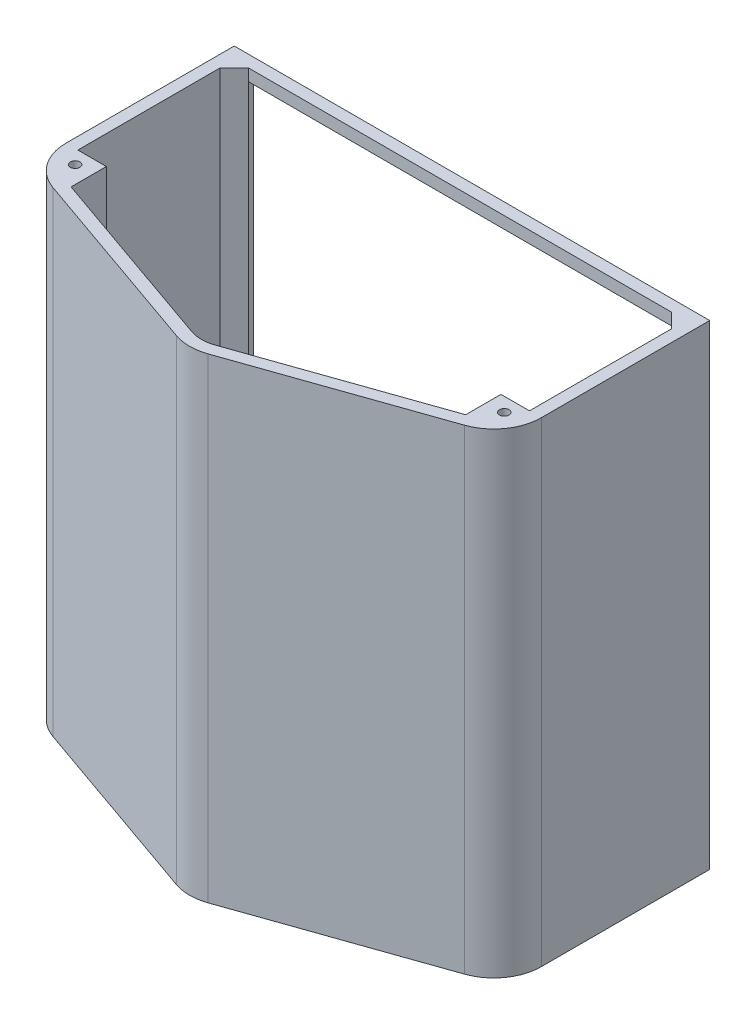
ISO-10303-21;
HEADER;
FILE_DESCRIPTION(('STEP AP214'),'2;1');
FILE_NAME('part.step','',(''),(''),'','','');
FILE_SCHEMA(('AUTOMOTIVE_DESIGN { 1 0 10303 214 1 1 1 1 }'));
ENDSEC;
DATA;
#1=APPLICATION_CONTEXT('core data for automotive mechanical design processes');
#2=APPLICATION_PROTOCOL_DEFINITION('international standard','automotive_design',2000,#1);
#3=PRODUCT_CONTEXT('',#1,'mechanical');
#4=PRODUCT('Part','Part','',(#3));
#5=PRODUCT_RELATED_PRODUCT_CATEGORY('part','',(#4));
#6=PRODUCT_DEFINITION_FORMATION('','',#4);
#7=PRODUCT_DEFINITION_CONTEXT('part definition',#1,'design');
#8=PRODUCT_DEFINITION('design','',#6,#7);
#9=PRODUCT_DEFINITION_SHAPE('','',#8);
#10=(LENGTH_UNIT() NAMED_UNIT(*) SI_UNIT(.MILLI.,.METRE.));
#11=(NAMED_UNIT(*) PLANE_ANGLE_UNIT() SI_UNIT($,.RADIAN.));
#12=(NAMED_UNIT(*) SI_UNIT($,.STERADIAN.) SOLID_ANGLE_UNIT());
#13=UNCERTAINTY_MEASURE_WITH_UNIT(LENGTH_MEASURE(1.E-05),#10,'distance_accuracy_value','');
#14=(GEOMETRIC_REPRESENTATION_CONTEXT(3) GLOBAL_UNCERTAINTY_ASSIGNED_CONTEXT((#13)) GLOBAL_UNIT_ASSIGNED_CONTEXT((#10,
#11,#12)) REPRESENTATION_CONTEXT('',''));
#15=CARTESIAN_POINT('',(0.,0.,0.));
#16=DIRECTION('',(0.,0.,1.));
#17=DIRECTION('',(1.,0.,0.));
#18=AXIS2_PLACEMENT_3D('',#15,#16,#17);
#19=CARTESIAN_POINT('',(15.0447436290785,200.,84.9682552450732));
#20=DIRECTION('',(0.330350424728106,0.,-0.943858356366017));
#21=DIRECTION('',(-0.943858356366017,0.,-0.330350424728106));
#22=AXIS2_PLACEMENT_3D('',#19,#20,#21);
#23=PLANE('',#22);
#24=DIRECTION('',(0.943858356366017,0.,0.330350424728106));
#25=VECTOR('',#24,1.);
#26=CARTESIAN_POINT('',(157.583719130192,0.,134.856896670463));
#27=LINE('',#26,#25);
#28=CARTESIAN_POINT('',(17.,0.,85.6525949748957));
#29=VERTEX_POINT('',#28);
#30=CARTESIAN_POINT('',(95.0447436290784,0.,112.968255245073));
#31=VERTEX_POINT('',#30);
#32=EDGE_CURVE('E236',#29,#31,#27,.T.);
#33=ORIENTED_EDGE('',*,*,#32,.F.);
#34=DIRECTION('',(0.,-1.,0.));
#35=VECTOR('',#34,1.);
#36=CARTESIAN_POINT('',(17.,200.,85.6525949748957));
#37=LINE('',#36,#35);
#38=CARTESIAN_POINT('',(17.,200.,85.6525949748957));
#39=VERTEX_POINT('',#38);
#40=EDGE_CURVE('E223',#39,#29,#37,.T.);
#41=ORIENTED_EDGE('',*,*,#40,.F.);
#42=DIRECTION('',(0.943858356366017,0.,0.330350424728106));
#43=VECTOR('',#42,1.);
#44=CARTESIAN_POINT('',(157.583719130192,200.,134.856896670463));
#45=LINE('',#44,#43);
#46=CARTESIAN_POINT('',(95.0447436290784,200.,112.968255245073));
#47=VERTEX_POINT('',#46);
#48=EDGE_CURVE('E234',#39,#47,#45,.T.);
#49=ORIENTED_EDGE('',*,*,#48,.T.);
#50=DIRECTION('',(0.,-1.,0.));
#51=VECTOR('',#50,1.);
#52=CARTESIAN_POINT('',(95.0447436290784,200.,112.968255245073));
#53=LINE('',#52,#51);
#54=EDGE_CURVE('E428',#47,#31,#53,.T.);
#55=ORIENTED_EDGE('',*,*,#54,.T.);
#56=EDGE_LOOP('',(#33,#41,#49,#55));
#57=FACE_BOUND('',#56,.T.);
#58=ADVANCED_FACE('F40',(#57),#23,.T.);
#59=CARTESIAN_POINT('',(184.955256370922,200.,84.9682552450732));
#60=DIRECTION('',(0.330350424728106,0.,0.943858356366017));
#61=DIRECTION('',(0.943858356366017,0.,-0.330350424728106));
#62=AXIS2_PLACEMENT_3D('',#59,#60,#61);
#63=PLANE('',#62);
#64=DIRECTION('',(0.,-1.,0.));
#65=VECTOR('',#64,1.);
#66=CARTESIAN_POINT('',(183.,200.,85.6525949748957));
#67=LINE('',#66,#65);
#68=CARTESIAN_POINT('',(183.,200.,85.6525949748957));
#69=VERTEX_POINT('',#68);
#70=CARTESIAN_POINT('',(183.,0.,85.6525949748957));
#71=VERTEX_POINT('',#70);
#72=EDGE_CURVE('E338',#69,#71,#67,.T.);
#73=ORIENTED_EDGE('',*,*,#72,.T.);
#74=DIRECTION('',(-0.943858356366017,0.,0.330350424728106));
#75=VECTOR('',#74,1.);
#76=CARTESIAN_POINT('',(184.955256370922,0.,84.9682552450732));
#77=LINE('',#76,#75);
#78=CARTESIAN_POINT('',(104.955256370922,0.,112.968255245073));
#79=VERTEX_POINT('',#78);
#80=EDGE_CURVE('E436',#71,#79,#77,.T.);
#81=ORIENTED_EDGE('',*,*,#80,.T.);
#82=DIRECTION('',(0.,1.,0.));
#83=VECTOR('',#82,1.);
#84=CARTESIAN_POINT('',(104.955256370922,200.,112.968255245073));
#85=LINE('',#84,#83);
#86=CARTESIAN_POINT('',(104.955256370922,200.,112.968255245073));
#87=VERTEX_POINT('',#86);
#88=EDGE_CURVE('E430',#87,#79,#85,.F.);
#89=ORIENTED_EDGE('',*,*,#88,.F.);
#90=DIRECTION('',(-0.943858356366017,0.,0.330350424728106));
#91=VECTOR('',#90,1.);
#92=CARTESIAN_POINT('',(184.955256370922,200.,84.9682552450732));
#93=LINE('',#92,#91);
#94=EDGE_CURVE('E65',#69,#87,#93,.T.);
#95=ORIENTED_EDGE('',*,*,#94,.F.);
#96=EDGE_LOOP('',(#73,#81,#89,#95));
#97=FACE_BOUND('',#96,.T.);
#98=ADVANCED_FACE('F473',(#97),#63,.F.);
#99=CARTESIAN_POINT('',(0.,200.,5.));
#100=DIRECTION('',(0.,0.,-1.));
#101=DIRECTION('',(-1.,0.,0.));
#102=AXIS2_PLACEMENT_3D('',#99,#100,#101);
#103=PLANE('',#102);
#104=DIRECTION('',(0.,-1.,0.));
#105=VECTOR('',#104,1.);
#106=CARTESIAN_POINT('',(11.,200.,5.));
#107=LINE('',#106,#105);
#108=CARTESIAN_POINT('',(11.,200.,5.));
#109=VERTEX_POINT('',#108);
#110=CARTESIAN_POINT('',(11.,195.,5.));
#111=VERTEX_POINT('',#110);
#112=EDGE_CURVE('E350',#109,#111,#107,.T.);
#113=ORIENTED_EDGE('',*,*,#112,.T.);
#114=DIRECTION('',(1.,0.,0.));
#115=VECTOR('',#114,1.);
#116=CARTESIAN_POINT('',(189.,195.,5.));
#117=LINE('',#116,#115);
#118=CARTESIAN_POINT('',(189.,195.,5.));
#119=VERTEX_POINT('',#118);
#120=EDGE_CURVE('E382',#111,#119,#117,.T.);
#121=ORIENTED_EDGE('',*,*,#120,.T.);
#122=DIRECTION('',(0.,-1.,0.));
#123=VECTOR('',#122,1.);
#124=CARTESIAN_POINT('',(189.,200.,5.));
#125=LINE('',#124,#123);
#126=CARTESIAN_POINT('',(189.,200.,5.));
#127=VERTEX_POINT('',#126);
#128=EDGE_CURVE('E237',#127,#119,#125,.T.);
#129=ORIENTED_EDGE('',*,*,#128,.F.);
#130=DIRECTION('',(1.,0.,0.));
#131=VECTOR('',#130,1.);
#132=CARTESIAN_POINT('',(180.,200.,5.));
#133=LINE('',#132,#131);
#134=EDGE_CURVE('E255',#109,#127,#133,.T.);
#135=ORIENTED_EDGE('',*,*,#134,.F.);
#136=EDGE_LOOP('',(#113,#121,#129,#135));
#137=FACE_BOUND('',#136,.T.);
#138=ADVANCED_FACE('F475',(#137),#103,.F.);
#139=CARTESIAN_POINT('',(5.,200.,0.));
#140=DIRECTION('',(1.,0.,0.));
#141=DIRECTION('',(0.,0.,-1.));
#142=AXIS2_PLACEMENT_3D('',#139,#140,#141);
#143=PLANE('',#142);
#144=DIRECTION('',(0.,0.,1.));
#145=VECTOR('',#144,1.);
#146=CARTESIAN_POINT('',(5.,0.,70.8103798995829));
#147=LINE('',#146,#145);
#148=CARTESIAN_POINT('',(5.,0.,11.));
#149=VERTEX_POINT('',#148);
#150=CARTESIAN_POINT('',(5.00000000000002,0.,70.8103798995828));
#151=VERTEX_POINT('',#150);
#152=EDGE_CURVE('E442',#149,#151,#147,.T.);
#153=ORIENTED_EDGE('',*,*,#152,.F.);
#154=DIRECTION('',(0.,-1.,0.));
#155=VECTOR('',#154,1.);
#156=CARTESIAN_POINT('',(5.,200.,11.));
#157=LINE('',#156,#155);
#158=CARTESIAN_POINT('',(5.,200.,11.));
#159=VERTEX_POINT('',#158);
#160=EDGE_CURVE('E356',#159,#149,#157,.T.);
#161=ORIENTED_EDGE('',*,*,#160,.F.);
#162=DIRECTION('',(0.,0.,1.));
#163=VECTOR('',#162,1.);
#164=CARTESIAN_POINT('',(5.,200.,70.8103798995829));
#165=LINE('',#164,#163);
#166=CARTESIAN_POINT('',(5.00000000000002,200.,70.8103798995828));
#167=VERTEX_POINT('',#166);
#168=EDGE_CURVE('E244',#159,#167,#165,.T.);
#169=ORIENTED_EDGE('',*,*,#168,.T.);
#170=DIRECTION('',(0.,-1.,0.));
#171=VECTOR('',#170,1.);
#172=CARTESIAN_POINT('',(5.00000000000002,200.,70.8103798995828));
#173=LINE('',#172,#171);
#174=EDGE_CURVE('E425',#167,#151,#173,.T.);
#175=ORIENTED_EDGE('',*,*,#174,.T.);
#176=EDGE_LOOP('',(#153,#161,#169,#175));
#177=FACE_BOUND('',#176,.T.);
#178=ADVANCED_FACE('F482',(#177),#143,.T.);
#179=CARTESIAN_POINT('',(195.,200.,0.));
#180=DIRECTION('',(1.,0.,0.));
#181=DIRECTION('',(0.,0.,-1.));
#182=AXIS2_PLACEMENT_3D('',#179,#180,#181);
#183=PLANE('',#182);
#184=DIRECTION('',(0.,-1.,0.));
#185=VECTOR('',#184,1.);
#186=CARTESIAN_POINT('',(195.,200.,11.));
#187=LINE('',#186,#185);
#188=CARTESIAN_POINT('',(195.,200.,11.));
#189=VERTEX_POINT('',#188);
#190=CARTESIAN_POINT('',(195.,0.,11.));
#191=VERTEX_POINT('',#190);
#192=EDGE_CURVE('E361',#189,#191,#187,.T.);
#193=ORIENTED_EDGE('',*,*,#192,.T.);
#194=DIRECTION('',(0.,0.,1.));
#195=VECTOR('',#194,1.);
#196=CARTESIAN_POINT('',(195.,0.,70.8103798995829));
#197=LINE('',#196,#195);
#198=CARTESIAN_POINT('',(195.,0.,70.8103798995828));
#199=VERTEX_POINT('',#198);
#200=EDGE_CURVE('E424',#191,#199,#197,.T.);
#201=ORIENTED_EDGE('',*,*,#200,.T.);
#202=DIRECTION('',(0.,1.,0.));
#203=VECTOR('',#202,1.);
#204=CARTESIAN_POINT('',(195.,200.,70.8103798995828));
#205=LINE('',#204,#203);
#206=CARTESIAN_POINT('',(195.,200.,70.8103798995828));
#207=VERTEX_POINT('',#206);
#208=EDGE_CURVE('E247',#207,#199,#205,.F.);
#209=ORIENTED_EDGE('',*,*,#208,.F.);
#210=DIRECTION('',(0.,0.,1.));
#211=VECTOR('',#210,1.);
#212=CARTESIAN_POINT('',(195.,200.,70.8103798995829));
#213=LINE('',#212,#211);
#214=EDGE_CURVE('E253',#189,#207,#213,.T.);
#215=ORIENTED_EDGE('',*,*,#214,.F.);
#216=EDGE_LOOP('',(#193,#201,#209,#215));
#217=FACE_BOUND('',#216,.T.);
#218=ADVANCED_FACE('F456',(#217),#183,.F.);
#219=CARTESIAN_POINT('',(0.,200.,0.));
#220=DIRECTION('',(0.,0.,-1.));
#221=DIRECTION('',(-1.,0.,0.));
#222=AXIS2_PLACEMENT_3D('',#219,#220,#221);
#223=PLANE('',#222);
#224=DIRECTION('',(1.,0.,0.));
#225=VECTOR('',#224,1.);
#226=CARTESIAN_POINT('',(0.,0.,0.));
#227=LINE('',#226,#225);
#228=CARTESIAN_POINT('',(195.,0.,0.));
#229=VERTEX_POINT('',#228);
#230=CARTESIAN_POINT('',(200.,0.,0.));
#231=VERTEX_POINT('',#230);
#232=EDGE_CURVE('E283',#229,#231,#227,.T.);
#233=ORIENTED_EDGE('',*,*,#232,.F.);
#234=DIRECTION('',(0.,-1.,0.));
#235=VECTOR('',#234,1.);
#236=CARTESIAN_POINT('',(195.,195.,0.));
#237=LINE('',#236,#235);
#238=CARTESIAN_POINT('',(195.,195.,0.));
#239=VERTEX_POINT('',#238);
#240=EDGE_CURVE('E422',#239,#229,#237,.T.);
#241=ORIENTED_EDGE('',*,*,#240,.F.);
#242=DIRECTION('',(-1.,0.,0.));
#243=VECTOR('',#242,1.);
#244=CARTESIAN_POINT('',(195.,195.,0.));
#245=LINE('',#244,#243);
#246=CARTESIAN_POINT('',(5.,195.,0.));
#247=VERTEX_POINT('',#246);
#248=EDGE_CURVE('E371',#239,#247,#245,.T.);
#249=ORIENTED_EDGE('',*,*,#248,.T.);
#250=DIRECTION('',(0.,-1.,0.));
#251=VECTOR('',#250,1.);
#252=CARTESIAN_POINT('',(5.,195.,0.));
#253=LINE('',#252,#251);
#254=CARTESIAN_POINT('',(5.,0.,0.));
#255=VERTEX_POINT('',#254);
#256=EDGE_CURVE('E419',#247,#255,#253,.T.);
#257=ORIENTED_EDGE('',*,*,#256,.T.);
#258=CARTESIAN_POINT('',(0.,0.,0.));
#259=VERTEX_POINT('',#258);
#260=EDGE_CURVE('E279',#259,#255,#227,.T.);
#261=ORIENTED_EDGE('',*,*,#260,.F.);
#262=DIRECTION('',(0.,-1.,0.));
#263=VECTOR('',#262,1.);
#264=CARTESIAN_POINT('',(0.,200.,0.));
#265=LINE('',#264,#263);
#266=CARTESIAN_POINT('',(0.,200.,0.));
#267=VERTEX_POINT('',#266);
#268=EDGE_CURVE('E11',#267,#259,#265,.T.);
#269=ORIENTED_EDGE('',*,*,#268,.F.);
#270=DIRECTION('',(1.,0.,0.));
#271=VECTOR('',#270,1.);
#272=CARTESIAN_POINT('',(0.,200.,0.));
#273=LINE('',#272,#271);
#274=CARTESIAN_POINT('',(200.,200.,0.));
#275=VERTEX_POINT('',#274);
#276=EDGE_CURVE('E256',#267,#275,#273,.T.);
#277=ORIENTED_EDGE('',*,*,#276,.T.);
#278=DIRECTION('',(0.,-1.,0.));
#279=VECTOR('',#278,1.);
#280=CARTESIAN_POINT('',(200.,200.,0.));
#281=LINE('',#280,#279);
#282=EDGE_CURVE('E278',#275,#231,#281,.T.);
#283=ORIENTED_EDGE('',*,*,#282,.T.);
#284=EDGE_LOOP('',(#233,#241,#249,#257,#261,#269,#277,#283));
#285=FACE_BOUND('',#284,.T.);
#286=ADVANCED_FACE('F42',(#285),#223,.T.);
#287=CARTESIAN_POINT('',(180.,0.,70.8103798995829));
#288=DIRECTION('',(0.,-1.,0.));
#289=DIRECTION('',(0.,0.,-1.));
#290=AXIS2_PLACEMENT_3D('',#287,#288,#289);
#291=PLANE('',#290);
#292=CARTESIAN_POINT('',(190.256543950699,0.,76.6773294732506));
#293=DIRECTION('',(0.,1.,0.));
#294=DIRECTION('',(0.,0.,1.));
#295=AXIS2_PLACEMENT_3D('',#292,#293,#294);
#296=CIRCLE('',#295,1.99857691297301);
#297=CARTESIAN_POINT('',(190.256543950699,0.,78.6759063862236));
#298=VERTEX_POINT('',#297);
#299=EDGE_CURVE('E317',#298,#298,#296,.T.);
#300=ORIENTED_EDGE('',*,*,#299,.T.);
#301=EDGE_LOOP('',(#300));
#302=FACE_BOUND('',#301,.T.);
#303=CARTESIAN_POINT('',(9.74345604930065,0.,76.6773294732507));
#304=DIRECTION('',(0.,1.,0.));
#305=DIRECTION('',(0.,0.,1.));
#306=AXIS2_PLACEMENT_3D('',#303,#304,#305);
#307=CIRCLE('',#306,1.99857691297292);
#308=CARTESIAN_POINT('',(9.74345604930065,0.,78.6759063862236));
#309=VERTEX_POINT('',#308);
#310=EDGE_CURVE('E323',#309,#309,#307,.T.);
#311=ORIENTED_EDGE('',*,*,#310,.T.);
#312=EDGE_LOOP('',(#311));
#313=FACE_BOUND('',#312,.T.);
#314=CARTESIAN_POINT('',(180.,0.,70.8103798995829));
#315=DIRECTION('',(0.,-1.,0.));
#316=DIRECTION('',(0.,0.,-1.));
#317=AXIS2_PLACEMENT_3D('',#314,#315,#316);
#318=CIRCLE('',#317,20.);
#319=CARTESIAN_POINT('',(200.,0.,70.8103798995828));
#320=VERTEX_POINT('',#319);
#321=CARTESIAN_POINT('',(186.607008494562,0.,89.6875470269033));
#322=VERTEX_POINT('',#321);
#323=EDGE_CURVE('E286',#320,#322,#318,.T.);
#324=ORIENTED_EDGE('',*,*,#323,.T.);
#325=DIRECTION('',(-0.943858356366017,0.,0.330350424728106));
#326=VECTOR('',#325,1.);
#327=CARTESIAN_POINT('',(186.607008494562,0.,89.6875470269033));
#328=LINE('',#327,#326);
#329=CARTESIAN_POINT('',(106.607008494562,0.,117.687547026903));
#330=VERTEX_POINT('',#329);
#331=EDGE_CURVE('E289',#322,#330,#328,.T.);
#332=ORIENTED_EDGE('',*,*,#331,.T.);
#333=CARTESIAN_POINT('',(100.,0.,98.8103798995829));
#334=DIRECTION('',(0.,1.,0.));
#335=DIRECTION('',(0.,0.,1.));
#336=AXIS2_PLACEMENT_3D('',#333,#334,#335);
#337=CIRCLE('',#336,20.);
#338=CARTESIAN_POINT('',(93.3929915054378,0.,117.687547026903));
#339=VERTEX_POINT('',#338);
#340=EDGE_CURVE('E292',#339,#330,#337,.T.);
#341=ORIENTED_EDGE('',*,*,#340,.F.);
#342=DIRECTION('',(0.943858356366017,0.,0.330350424728106));
#343=VECTOR('',#342,1.);
#344=CARTESIAN_POINT('',(13.392991505438,0.,89.6875470269033));
#345=LINE('',#344,#343);
#346=CARTESIAN_POINT('',(13.392991505438,0.,89.6875470269033));
#347=VERTEX_POINT('',#346);
#348=EDGE_CURVE('E295',#347,#339,#345,.T.);
#349=ORIENTED_EDGE('',*,*,#348,.F.);
#350=CARTESIAN_POINT('',(20.,0.,70.8103798995829));
#351=DIRECTION('',(0.,-1.,0.));
#352=DIRECTION('',(0.,0.,-1.));
#353=AXIS2_PLACEMENT_3D('',#350,#351,#352);
#354=CIRCLE('',#353,20.);
#355=CARTESIAN_POINT('',(0.,0.,70.8103798995828));
#356=VERTEX_POINT('',#355);
#357=EDGE_CURVE('E297',#347,#356,#354,.T.);
#358=ORIENTED_EDGE('',*,*,#357,.T.);
#359=DIRECTION('',(0.,0.,1.));
#360=VECTOR('',#359,1.);
#361=CARTESIAN_POINT('',(0.,0.,0.));
#362=LINE('',#361,#360);
#363=EDGE_CURVE('E260',#259,#356,#362,.T.);
#364=ORIENTED_EDGE('',*,*,#363,.F.);
#365=ORIENTED_EDGE('',*,*,#260,.T.);
#366=DIRECTION('',(0.,0.,1.));
#367=VECTOR('',#366,1.);
#368=CARTESIAN_POINT('',(5.,0.,0.));
#369=LINE('',#368,#367);
#370=CARTESIAN_POINT('',(5.,0.,3.));
#371=VERTEX_POINT('',#370);
#372=EDGE_CURVE('E392',#255,#371,#369,.T.);
#373=ORIENTED_EDGE('',*,*,#372,.T.);
#374=DIRECTION('',(1.,0.,0.));
#375=VECTOR('',#374,1.);
#376=CARTESIAN_POINT('',(5.,0.,3.));
#377=LINE('',#376,#375);
#378=CARTESIAN_POINT('',(11.,0.,3.));
#379=VERTEX_POINT('',#378);
#380=EDGE_CURVE('E395',#371,#379,#377,.T.);
#381=ORIENTED_EDGE('',*,*,#380,.T.);
#382=DIRECTION('',(0.,0.,1.));
#383=VECTOR('',#382,1.);
#384=CARTESIAN_POINT('',(11.,0.,3.));
#385=LINE('',#384,#383);
#386=CARTESIAN_POINT('',(11.,0.,5.00000000000002));
#387=VERTEX_POINT('',#386);
#388=EDGE_CURVE('E398',#379,#387,#385,.T.);
#389=ORIENTED_EDGE('',*,*,#388,.T.);
#390=DIRECTION('',(0.707106781186547,0.,-0.707106781186547));
#391=VECTOR('',#390,1.);
#392=CARTESIAN_POINT('',(5.,0.,11.));
#393=LINE('',#392,#391);
#394=EDGE_CURVE('E351',#149,#387,#393,.T.);
#395=ORIENTED_EDGE('',*,*,#394,.F.);
#396=ORIENTED_EDGE('',*,*,#152,.T.);
#397=DIRECTION('',(-1.,0.,0.));
#398=VECTOR('',#397,1.);
#399=CARTESIAN_POINT('',(5.00000000000002,0.,70.8103798995828));
#400=LINE('',#399,#398);
#401=CARTESIAN_POINT('',(17.,0.,70.8103798995829));
#402=VERTEX_POINT('',#401);
#403=EDGE_CURVE('E330',#402,#151,#400,.T.);
#404=ORIENTED_EDGE('',*,*,#403,.F.);
#405=DIRECTION('',(0.,0.,-1.));
#406=VECTOR('',#405,1.);
#407=CARTESIAN_POINT('',(17.,0.,70.8103798995829));
#408=LINE('',#407,#406);
#409=EDGE_CURVE('E57',#29,#402,#408,.T.);
#410=ORIENTED_EDGE('',*,*,#409,.F.);
#411=ORIENTED_EDGE('',*,*,#32,.T.);
#412=CARTESIAN_POINT('',(100.,0.,98.8103798995829));
#413=DIRECTION('',(0.,-1.,0.));
#414=DIRECTION('',(0.,0.,-1.));
#415=AXIS2_PLACEMENT_3D('',#412,#413,#414);
#416=CIRCLE('',#415,15.);
#417=EDGE_CURVE('E438',#31,#79,#416,.F.);
#418=ORIENTED_EDGE('',*,*,#417,.T.);
#419=ORIENTED_EDGE('',*,*,#80,.F.);
#420=DIRECTION('',(0.,0.,1.));
#421=VECTOR('',#420,1.);
#422=CARTESIAN_POINT('',(183.,0.,70.8103798995828));
#423=LINE('',#422,#421);
#424=CARTESIAN_POINT('',(183.,0.,70.8103798995828));
#425=VERTEX_POINT('',#424);
#426=EDGE_CURVE('E341',#425,#71,#423,.T.);
#427=ORIENTED_EDGE('',*,*,#426,.F.);
#428=DIRECTION('',(-1.,0.,0.));
#429=VECTOR('',#428,1.);
#430=CARTESIAN_POINT('',(195.,0.,70.8103798995828));
#431=LINE('',#430,#429);
#432=EDGE_CURVE('E333',#199,#425,#431,.T.);
#433=ORIENTED_EDGE('',*,*,#432,.F.);
#434=ORIENTED_EDGE('',*,*,#200,.F.);
#435=DIRECTION('',(0.707106781186548,0.,0.707106781186547));
#436=VECTOR('',#435,1.);
#437=CARTESIAN_POINT('',(195.,0.,11.));
#438=LINE('',#437,#436);
#439=CARTESIAN_POINT('',(189.,0.,5.));
#440=VERTEX_POINT('',#439);
#441=EDGE_CURVE('E353',#440,#191,#438,.T.);
#442=ORIENTED_EDGE('',*,*,#441,.F.);
#443=DIRECTION('',(0.,0.,-1.));
#444=VECTOR('',#443,1.);
#445=CARTESIAN_POINT('',(189.,0.,3.));
#446=LINE('',#445,#444);
#447=CARTESIAN_POINT('',(189.,0.,3.));
#448=VERTEX_POINT('',#447);
#449=EDGE_CURVE('E401',#440,#448,#446,.T.);
#450=ORIENTED_EDGE('',*,*,#449,.T.);
#451=DIRECTION('',(1.,0.,0.));
#452=VECTOR('',#451,1.);
#453=CARTESIAN_POINT('',(189.,0.,3.));
#454=LINE('',#453,#452);
#455=CARTESIAN_POINT('',(195.,0.,3.));
#456=VERTEX_POINT('',#455);
#457=EDGE_CURVE('E372',#448,#456,#454,.T.);
#458=ORIENTED_EDGE('',*,*,#457,.T.);
#459=DIRECTION('',(0.,0.,-1.));
#460=VECTOR('',#459,1.);
#461=CARTESIAN_POINT('',(195.,0.,3.));
#462=LINE('',#461,#460);
#463=EDGE_CURVE('E358',#456,#229,#462,.T.);
#464=ORIENTED_EDGE('',*,*,#463,.T.);
#465=ORIENTED_EDGE('',*,*,#232,.T.);
#466=DIRECTION('',(0.,0.,1.));
#467=VECTOR('',#466,1.);
#468=CARTESIAN_POINT('',(200.,0.,0.));
#469=LINE('',#468,#467);
#470=EDGE_CURVE('E282',#231,#320,#469,.T.);
#471=ORIENTED_EDGE('',*,*,#470,.T.);
#472=EDGE_LOOP('',(#324,#332,#341,#349,#358,#364,#365,#373,#381,#389,#395,#396,#404,#410,#411,
#418,#419,#427,#433,#434,#442,#450,#458,#464,#465,#471));
#473=FACE_BOUND('',#472,.T.);
#474=ADVANCED_FACE('F459',(#302,#313,#473),#291,.T.);
#475=CARTESIAN_POINT('',(0.,200.,0.));
#476=DIRECTION('',(1.,0.,0.));
#477=DIRECTION('',(0.,0.,-1.));
#478=AXIS2_PLACEMENT_3D('',#475,#476,#477);
#479=PLANE('',#478);
#480=ORIENTED_EDGE('',*,*,#363,.T.);
#481=DIRECTION('',(0.,-1.,0.));
#482=VECTOR('',#481,1.);
#483=CARTESIAN_POINT('',(0.,200.,70.8103798995828));
#484=LINE('',#483,#482);
#485=CARTESIAN_POINT('',(0.,200.,70.8103798995828));
#486=VERTEX_POINT('',#485);
#487=EDGE_CURVE('E49',#486,#356,#484,.T.);
#488=ORIENTED_EDGE('',*,*,#487,.F.);
#489=DIRECTION('',(0.,0.,1.));
#490=VECTOR('',#489,1.);
#491=CARTESIAN_POINT('',(0.,200.,0.));
#492=LINE('',#491,#490);
#493=EDGE_CURVE('E276',#267,#486,#492,.T.);
#494=ORIENTED_EDGE('',*,*,#493,.F.);
#495=ORIENTED_EDGE('',*,*,#268,.T.);
#496=EDGE_LOOP('',(#480,#488,#494,#495));
#497=FACE_BOUND('',#496,.T.);
#498=ADVANCED_FACE('F495',(#497),#479,.F.);
#499=CARTESIAN_POINT('',(20.,200.,70.8103798995829));
#500=DIRECTION('',(0.,-1.,0.));
#501=DIRECTION('',(0.,0.,-1.));
#502=AXIS2_PLACEMENT_3D('',#499,#500,#501);
#503=CYLINDRICAL_SURFACE('',#502,20.);
#504=ORIENTED_EDGE('',*,*,#357,.F.);
#505=DIRECTION('',(0.,-1.,0.));
#506=VECTOR('',#505,1.);
#507=CARTESIAN_POINT('',(13.392991505438,200.,89.6875470269033));
#508=LINE('',#507,#506);
#509=CARTESIAN_POINT('',(13.392991505438,200.,89.6875470269033));
#510=VERTEX_POINT('',#509);
#511=EDGE_CURVE('E303',#510,#347,#508,.T.);
#512=ORIENTED_EDGE('',*,*,#511,.F.);
#513=CARTESIAN_POINT('',(20.,200.,70.8103798995829));
#514=DIRECTION('',(0.,-1.,0.));
#515=DIRECTION('',(0.,0.,-1.));
#516=AXIS2_PLACEMENT_3D('',#513,#514,#515);
#517=CIRCLE('',#516,20.);
#518=EDGE_CURVE('E273',#510,#486,#517,.T.);
#519=ORIENTED_EDGE('',*,*,#518,.T.);
#520=ORIENTED_EDGE('',*,*,#487,.T.);
#521=EDGE_LOOP('',(#504,#512,#519,#520));
#522=FACE_BOUND('',#521,.T.);
#523=ADVANCED_FACE('F498',(#522),#503,.T.);
#524=CARTESIAN_POINT('',(13.392991505438,200.,89.6875470269033));
#525=DIRECTION('',(0.330350424728106,0.,-0.943858356366017));
#526=DIRECTION('',(-0.943858356366017,0.,-0.330350424728106));
#527=AXIS2_PLACEMENT_3D('',#524,#525,#526);
#528=PLANE('',#527);
#529=ORIENTED_EDGE('',*,*,#348,.T.);
#530=DIRECTION('',(0.,-1.,0.));
#531=VECTOR('',#530,1.);
#532=CARTESIAN_POINT('',(93.3929915054378,200.,117.687547026903));
#533=LINE('',#532,#531);
#534=CARTESIAN_POINT('',(93.3929915054378,200.,117.687547026903));
#535=VERTEX_POINT('',#534);
#536=EDGE_CURVE('E305',#535,#339,#533,.T.);
#537=ORIENTED_EDGE('',*,*,#536,.F.);
#538=DIRECTION('',(0.943858356366017,0.,0.330350424728106));
#539=VECTOR('',#538,1.);
#540=CARTESIAN_POINT('',(13.392991505438,200.,89.6875470269033));
#541=LINE('',#540,#539);
#542=EDGE_CURVE('E271',#510,#535,#541,.T.);
#543=ORIENTED_EDGE('',*,*,#542,.F.);
#544=ORIENTED_EDGE('',*,*,#511,.T.);
#545=EDGE_LOOP('',(#529,#537,#543,#544));
#546=FACE_BOUND('',#545,.T.);
#547=ADVANCED_FACE('F502',(#546),#528,.F.);
#548=CARTESIAN_POINT('',(100.,200.,98.8103798995829));
#549=DIRECTION('',(0.,-1.,0.));
#550=DIRECTION('',(0.,0.,-1.));
#551=AXIS2_PLACEMENT_3D('',#548,#549,#550);
#552=CYLINDRICAL_SURFACE('',#551,20.);
#553=ORIENTED_EDGE('',*,*,#340,.T.);
#554=DIRECTION('',(0.,-1.,0.));
#555=VECTOR('',#554,1.);
#556=CARTESIAN_POINT('',(106.607008494562,200.,117.687547026903));
#557=LINE('',#556,#555);
#558=CARTESIAN_POINT('',(106.607008494562,200.,117.687547026903));
#559=VERTEX_POINT('',#558);
#560=EDGE_CURVE('E308',#559,#330,#557,.T.);
#561=ORIENTED_EDGE('',*,*,#560,.F.);
#562=CARTESIAN_POINT('',(100.,200.,98.8103798995829));
#563=DIRECTION('',(0.,1.,0.));
#564=DIRECTION('',(0.,0.,1.));
#565=AXIS2_PLACEMENT_3D('',#562,#563,#564);
#566=CIRCLE('',#565,20.);
#567=EDGE_CURVE('E269',#535,#559,#566,.T.);
#568=ORIENTED_EDGE('',*,*,#567,.F.);
#569=ORIENTED_EDGE('',*,*,#536,.T.);
#570=EDGE_LOOP('',(#553,#561,#568,#569));
#571=FACE_BOUND('',#570,.T.);
#572=ADVANCED_FACE('F506',(#571),#552,.T.);
#573=CARTESIAN_POINT('',(186.607008494562,200.,89.6875470269033));
#574=DIRECTION('',(0.330350424728106,0.,0.943858356366017));
#575=DIRECTION('',(0.943858356366017,0.,-0.330350424728106));
#576=AXIS2_PLACEMENT_3D('',#573,#574,#575);
#577=PLANE('',#576);
#578=ORIENTED_EDGE('',*,*,#331,.F.);
#579=DIRECTION('',(0.,-1.,0.));
#580=VECTOR('',#579,1.);
#581=CARTESIAN_POINT('',(186.607008494562,200.,89.6875470269033));
#582=LINE('',#581,#580);
#583=CARTESIAN_POINT('',(186.607008494562,200.,89.6875470269033));
#584=VERTEX_POINT('',#583);
#585=EDGE_CURVE('E310',#584,#322,#582,.T.);
#586=ORIENTED_EDGE('',*,*,#585,.F.);
#587=DIRECTION('',(-0.943858356366017,0.,0.330350424728106));
#588=VECTOR('',#587,1.);
#589=CARTESIAN_POINT('',(186.607008494562,200.,89.6875470269033));
#590=LINE('',#589,#588);
#591=EDGE_CURVE('E266',#584,#559,#590,.T.);
#592=ORIENTED_EDGE('',*,*,#591,.T.);
#593=ORIENTED_EDGE('',*,*,#560,.T.);
#594=EDGE_LOOP('',(#578,#586,#592,#593));
#595=FACE_BOUND('',#594,.T.);
#596=ADVANCED_FACE('F510',(#595),#577,.T.);
#597=CARTESIAN_POINT('',(180.,200.,70.8103798995829));
#598=DIRECTION('',(0.,-1.,0.));
#599=DIRECTION('',(0.,0.,-1.));
#600=AXIS2_PLACEMENT_3D('',#597,#598,#599);
#601=CYLINDRICAL_SURFACE('',#600,20.);
#602=ORIENTED_EDGE('',*,*,#323,.F.);
#603=DIRECTION('',(0.,-1.,0.));
#604=VECTOR('',#603,1.);
#605=CARTESIAN_POINT('',(200.,200.,70.8103798995828));
#606=LINE('',#605,#604);
#607=CARTESIAN_POINT('',(200.,200.,70.8103798995828));
#608=VERTEX_POINT('',#607);
#609=EDGE_CURVE('E312',#608,#320,#606,.T.);
#610=ORIENTED_EDGE('',*,*,#609,.F.);
#611=CARTESIAN_POINT('',(180.,200.,70.8103798995829));
#612=DIRECTION('',(0.,-1.,0.));
#613=DIRECTION('',(0.,0.,-1.));
#614=AXIS2_PLACEMENT_3D('',#611,#612,#613);
#615=CIRCLE('',#614,20.);
#616=EDGE_CURVE('E263',#608,#584,#615,.T.);
#617=ORIENTED_EDGE('',*,*,#616,.T.);
#618=ORIENTED_EDGE('',*,*,#585,.T.);
#619=EDGE_LOOP('',(#602,#610,#617,#618));
#620=FACE_BOUND('',#619,.T.);
#621=ADVANCED_FACE('F514',(#620),#601,.T.);
#622=CARTESIAN_POINT('',(200.,200.,0.));
#623=DIRECTION('',(1.,0.,0.));
#624=DIRECTION('',(0.,0.,-1.));
#625=AXIS2_PLACEMENT_3D('',#622,#623,#624);
#626=PLANE('',#625);
#627=ORIENTED_EDGE('',*,*,#470,.F.);
#628=ORIENTED_EDGE('',*,*,#282,.F.);
#629=DIRECTION('',(0.,0.,1.));
#630=VECTOR('',#629,1.);
#631=CARTESIAN_POINT('',(200.,200.,0.));
#632=LINE('',#631,#630);
#633=EDGE_CURVE('E259',#275,#608,#632,.T.);
#634=ORIENTED_EDGE('',*,*,#633,.T.);
#635=ORIENTED_EDGE('',*,*,#609,.T.);
#636=EDGE_LOOP('',(#627,#628,#634,#635));
#637=FACE_BOUND('',#636,.T.);
#638=ADVANCED_FACE('F491',(#637),#626,.T.);
#639=CARTESIAN_POINT('',(180.,200.,70.8103798995829));
#640=DIRECTION('',(0.,-1.,0.));
#641=DIRECTION('',(0.,0.,-1.));
#642=AXIS2_PLACEMENT_3D('',#639,#640,#641);
#643=PLANE('',#642);
#644=CARTESIAN_POINT('',(190.256543950699,200.,76.6773294732506));
#645=DIRECTION('',(0.,-1.,0.));
#646=DIRECTION('',(0.,0.,-1.));
#647=AXIS2_PLACEMENT_3D('',#644,#645,#646);
#648=CIRCLE('',#647,1.99857691297301);
#649=CARTESIAN_POINT('',(190.256543950699,200.,74.6787525602776));
#650=VERTEX_POINT('',#649);
#651=EDGE_CURVE('E44',#650,#650,#648,.F.);
#652=ORIENTED_EDGE('',*,*,#651,.F.);
#653=EDGE_LOOP('',(#652));
#654=FACE_BOUND('',#653,.T.);
#655=CARTESIAN_POINT('',(9.74345604930065,200.,76.6773294732507));
#656=DIRECTION('',(0.,-1.,0.));
#657=DIRECTION('',(0.,0.,-1.));
#658=AXIS2_PLACEMENT_3D('',#655,#656,#657);
#659=CIRCLE('',#658,1.99857691297292);
#660=CARTESIAN_POINT('',(9.74345604930065,200.,74.6787525602778));
#661=VERTEX_POINT('',#660);
#662=EDGE_CURVE('E315',#661,#661,#659,.F.);
#663=ORIENTED_EDGE('',*,*,#662,.F.);
#664=EDGE_LOOP('',(#663));
#665=FACE_BOUND('',#664,.T.);
#666=ORIENTED_EDGE('',*,*,#48,.F.);
#667=DIRECTION('',(0.,0.,-1.));
#668=VECTOR('',#667,1.);
#669=CARTESIAN_POINT('',(17.,200.,70.8103798995829));
#670=LINE('',#669,#668);
#671=CARTESIAN_POINT('',(17.,200.,70.8103798995829));
#672=VERTEX_POINT('',#671);
#673=EDGE_CURVE('E220',#39,#672,#670,.T.);
#674=ORIENTED_EDGE('',*,*,#673,.T.);
#675=DIRECTION('',(-1.,0.,0.));
#676=VECTOR('',#675,1.);
#677=CARTESIAN_POINT('',(5.00000000000002,200.,70.8103798995828));
#678=LINE('',#677,#676);
#679=EDGE_CURVE('E230',#672,#167,#678,.T.);
#680=ORIENTED_EDGE('',*,*,#679,.T.);
#681=ORIENTED_EDGE('',*,*,#168,.F.);
#682=DIRECTION('',(0.707106781186547,0.,-0.707106781186547));
#683=VECTOR('',#682,1.);
#684=CARTESIAN_POINT('',(5.,200.,11.));
#685=LINE('',#684,#683);
#686=EDGE_CURVE('E348',#159,#109,#685,.T.);
#687=ORIENTED_EDGE('',*,*,#686,.T.);
#688=ORIENTED_EDGE('',*,*,#134,.T.);
#689=DIRECTION('',(0.707106781186548,0.,0.707106781186547));
#690=VECTOR('',#689,1.);
#691=CARTESIAN_POINT('',(195.,200.,11.));
#692=LINE('',#691,#690);
#693=EDGE_CURVE('E363',#127,#189,#692,.T.);
#694=ORIENTED_EDGE('',*,*,#693,.T.);
#695=ORIENTED_EDGE('',*,*,#214,.T.);
#696=DIRECTION('',(-1.,0.,0.));
#697=VECTOR('',#696,1.);
#698=CARTESIAN_POINT('',(200.,200.,70.8103798995828));
#699=LINE('',#698,#697);
#700=CARTESIAN_POINT('',(183.,200.,70.8103798995828));
#701=VERTEX_POINT('',#700);
#702=EDGE_CURVE('E344',#207,#701,#699,.T.);
#703=ORIENTED_EDGE('',*,*,#702,.T.);
#704=DIRECTION('',(0.,0.,1.));
#705=VECTOR('',#704,1.);
#706=CARTESIAN_POINT('',(183.,200.,70.8103798995828));
#707=LINE('',#706,#705);
#708=EDGE_CURVE('E340',#701,#69,#707,.T.);
#709=ORIENTED_EDGE('',*,*,#708,.T.);
#710=ORIENTED_EDGE('',*,*,#94,.T.);
#711=CARTESIAN_POINT('',(100.,200.,98.8103798995829));
#712=DIRECTION('',(0.,-1.,0.));
#713=DIRECTION('',(0.,0.,-1.));
#714=AXIS2_PLACEMENT_3D('',#711,#712,#713);
#715=CIRCLE('',#714,15.);
#716=EDGE_CURVE('E243',#47,#87,#715,.F.);
#717=ORIENTED_EDGE('',*,*,#716,.F.);
#718=EDGE_LOOP('',(#666,#674,#680,#681,#687,#688,#694,#695,#703,#709,#710,#717));
#719=FACE_BOUND('',#718,.T.);
#720=ORIENTED_EDGE('',*,*,#493,.T.);
#721=ORIENTED_EDGE('',*,*,#518,.F.);
#722=ORIENTED_EDGE('',*,*,#542,.T.);
#723=ORIENTED_EDGE('',*,*,#567,.T.);
#724=ORIENTED_EDGE('',*,*,#591,.F.);
#725=ORIENTED_EDGE('',*,*,#616,.F.);
#726=ORIENTED_EDGE('',*,*,#633,.F.);
#727=ORIENTED_EDGE('',*,*,#276,.F.);
#728=EDGE_LOOP('',(#720,#721,#722,#723,#724,#725,#726,#727));
#729=FACE_BOUND('',#728,.T.);
#730=ADVANCED_FACE('F240',(#654,#665,#719,#729),#643,.F.);
#731=CARTESIAN_POINT('',(100.,200.,98.8103798995829));
#732=DIRECTION('',(0.,-1.,0.));
#733=DIRECTION('',(0.,0.,-1.));
#734=AXIS2_PLACEMENT_3D('',#731,#732,#733);
#735=CYLINDRICAL_SURFACE('',#734,15.);
#736=ORIENTED_EDGE('',*,*,#417,.F.);
#737=ORIENTED_EDGE('',*,*,#54,.F.);
#738=ORIENTED_EDGE('',*,*,#716,.T.);
#739=ORIENTED_EDGE('',*,*,#88,.T.);
#740=EDGE_LOOP('',(#736,#737,#738,#739));
#741=FACE_BOUND('',#740,.T.);
#742=ADVANCED_FACE('F472',(#741),#735,.F.);
#743=CARTESIAN_POINT('',(195.,195.,3.));
#744=DIRECTION('',(-1.,0.,0.));
#745=DIRECTION('',(0.,0.,1.));
#746=AXIS2_PLACEMENT_3D('',#743,#744,#745);
#747=PLANE('',#746);
#748=ORIENTED_EDGE('',*,*,#463,.F.);
#749=DIRECTION('',(0.,-1.,0.));
#750=VECTOR('',#749,1.);
#751=CARTESIAN_POINT('',(195.,195.,3.));
#752=LINE('',#751,#750);
#753=CARTESIAN_POINT('',(195.,195.,3.));
#754=VERTEX_POINT('',#753);
#755=EDGE_CURVE('E389',#754,#456,#752,.T.);
#756=ORIENTED_EDGE('',*,*,#755,.F.);
#757=DIRECTION('',(0.,0.,-1.));
#758=VECTOR('',#757,1.);
#759=CARTESIAN_POINT('',(195.,195.,3.));
#760=LINE('',#759,#758);
#761=EDGE_CURVE('E368',#754,#239,#760,.T.);
#762=ORIENTED_EDGE('',*,*,#761,.T.);
#763=ORIENTED_EDGE('',*,*,#240,.T.);
#764=EDGE_LOOP('',(#748,#756,#762,#763));
#765=FACE_BOUND('',#764,.T.);
#766=ADVANCED_FACE('F605',(#765),#747,.T.);
#767=CARTESIAN_POINT('',(5.,195.,0.));
#768=DIRECTION('',(1.,0.,0.));
#769=DIRECTION('',(0.,0.,-1.));
#770=AXIS2_PLACEMENT_3D('',#767,#768,#769);
#771=PLANE('',#770);
#772=ORIENTED_EDGE('',*,*,#372,.F.);
#773=ORIENTED_EDGE('',*,*,#256,.F.);
#774=DIRECTION('',(0.,0.,1.));
#775=VECTOR('',#774,1.);
#776=CARTESIAN_POINT('',(5.,195.,0.));
#777=LINE('',#776,#775);
#778=CARTESIAN_POINT('',(5.,195.,3.));
#779=VERTEX_POINT('',#778);
#780=EDGE_CURVE('E375',#247,#779,#777,.T.);
#781=ORIENTED_EDGE('',*,*,#780,.T.);
#782=DIRECTION('',(0.,-1.,0.));
#783=VECTOR('',#782,1.);
#784=CARTESIAN_POINT('',(5.,195.,3.));
#785=LINE('',#784,#783);
#786=EDGE_CURVE('E417',#779,#371,#785,.T.);
#787=ORIENTED_EDGE('',*,*,#786,.T.);
#788=EDGE_LOOP('',(#772,#773,#781,#787));
#789=FACE_BOUND('',#788,.T.);
#790=ADVANCED_FACE('F548',(#789),#771,.T.);
#791=CARTESIAN_POINT('',(5.,195.,3.));
#792=DIRECTION('',(0.,0.,-1.));
#793=DIRECTION('',(-1.,0.,0.));
#794=AXIS2_PLACEMENT_3D('',#791,#792,#793);
#795=PLANE('',#794);
#796=ORIENTED_EDGE('',*,*,#380,.F.);
#797=ORIENTED_EDGE('',*,*,#786,.F.);
#798=DIRECTION('',(1.,0.,0.));
#799=VECTOR('',#798,1.);
#800=CARTESIAN_POINT('',(5.,195.,3.));
#801=LINE('',#800,#799);
#802=CARTESIAN_POINT('',(11.,195.,3.));
#803=VERTEX_POINT('',#802);
#804=EDGE_CURVE('E377',#779,#803,#801,.T.);
#805=ORIENTED_EDGE('',*,*,#804,.T.);
#806=DIRECTION('',(0.,-1.,0.));
#807=VECTOR('',#806,1.);
#808=CARTESIAN_POINT('',(11.,195.,3.));
#809=LINE('',#808,#807);
#810=EDGE_CURVE('E415',#803,#379,#809,.T.);
#811=ORIENTED_EDGE('',*,*,#810,.T.);
#812=EDGE_LOOP('',(#796,#797,#805,#811));
#813=FACE_BOUND('',#812,.T.);
#814=ADVANCED_FACE('F559',(#813),#795,.T.);
#815=CARTESIAN_POINT('',(11.,195.,3.));
#816=DIRECTION('',(1.,0.,0.));
#817=DIRECTION('',(0.,0.,-1.));
#818=AXIS2_PLACEMENT_3D('',#815,#816,#817);
#819=PLANE('',#818);
#820=ORIENTED_EDGE('',*,*,#388,.F.);
#821=ORIENTED_EDGE('',*,*,#810,.F.);
#822=DIRECTION('',(0.,0.,1.));
#823=VECTOR('',#822,1.);
#824=CARTESIAN_POINT('',(11.,195.,3.));
#825=LINE('',#824,#823);
#826=EDGE_CURVE('E379',#803,#111,#825,.T.);
#827=ORIENTED_EDGE('',*,*,#826,.T.);
#828=DIRECTION('',(0.,-1.,0.));
#829=VECTOR('',#828,1.);
#830=CARTESIAN_POINT('',(11.,195.,5.00000000000002));
#831=LINE('',#830,#829);
#832=EDGE_CURVE('E412',#111,#387,#831,.T.);
#833=ORIENTED_EDGE('',*,*,#832,.T.);
#834=EDGE_LOOP('',(#820,#821,#827,#833));
#835=FACE_BOUND('',#834,.T.);
#836=ADVANCED_FACE('F562',(#835),#819,.T.);
#837=CARTESIAN_POINT('',(189.,195.,3.));
#838=DIRECTION('',(-1.,0.,0.));
#839=DIRECTION('',(0.,0.,1.));
#840=AXIS2_PLACEMENT_3D('',#837,#838,#839);
#841=PLANE('',#840);
#842=ORIENTED_EDGE('',*,*,#449,.F.);
#843=DIRECTION('',(0.,-1.,0.));
#844=VECTOR('',#843,1.);
#845=CARTESIAN_POINT('',(189.,195.,5.));
#846=LINE('',#845,#844);
#847=EDGE_CURVE('E409',#119,#440,#846,.T.);
#848=ORIENTED_EDGE('',*,*,#847,.F.);
#849=DIRECTION('',(0.,0.,-1.));
#850=VECTOR('',#849,1.);
#851=CARTESIAN_POINT('',(189.,195.,3.));
#852=LINE('',#851,#850);
#853=CARTESIAN_POINT('',(189.,195.,3.));
#854=VERTEX_POINT('',#853);
#855=EDGE_CURVE('E385',#119,#854,#852,.T.);
#856=ORIENTED_EDGE('',*,*,#855,.T.);
#857=DIRECTION('',(0.,-1.,0.));
#858=VECTOR('',#857,1.);
#859=CARTESIAN_POINT('',(189.,195.,3.));
#860=LINE('',#859,#858);
#861=EDGE_CURVE('E407',#854,#448,#860,.T.);
#862=ORIENTED_EDGE('',*,*,#861,.T.);
#863=EDGE_LOOP('',(#842,#848,#856,#862));
#864=FACE_BOUND('',#863,.T.);
#865=ADVANCED_FACE('F594',(#864),#841,.T.);
#866=CARTESIAN_POINT('',(189.,195.,3.));
#867=DIRECTION('',(0.,0.,-1.));
#868=DIRECTION('',(-1.,0.,0.));
#869=AXIS2_PLACEMENT_3D('',#866,#867,#868);
#870=PLANE('',#869);
#871=ORIENTED_EDGE('',*,*,#457,.F.);
#872=ORIENTED_EDGE('',*,*,#861,.F.);
#873=DIRECTION('',(1.,0.,0.));
#874=VECTOR('',#873,1.);
#875=CARTESIAN_POINT('',(189.,195.,3.));
#876=LINE('',#875,#874);
#877=EDGE_CURVE('E387',#854,#754,#876,.T.);
#878=ORIENTED_EDGE('',*,*,#877,.T.);
#879=ORIENTED_EDGE('',*,*,#755,.T.);
#880=EDGE_LOOP('',(#871,#872,#878,#879));
#881=FACE_BOUND('',#880,.T.);
#882=ADVANCED_FACE('F591',(#881),#870,.T.);
#883=CARTESIAN_POINT('',(0.,195.,0.));
#884=DIRECTION('',(0.,1.,0.));
#885=DIRECTION('',(0.,0.,1.));
#886=AXIS2_PLACEMENT_3D('',#883,#884,#885);
#887=PLANE('',#886);
#888=ORIENTED_EDGE('',*,*,#761,.F.);
#889=ORIENTED_EDGE('',*,*,#877,.F.);
#890=ORIENTED_EDGE('',*,*,#855,.F.);
#891=ORIENTED_EDGE('',*,*,#120,.F.);
#892=ORIENTED_EDGE('',*,*,#826,.F.);
#893=ORIENTED_EDGE('',*,*,#804,.F.);
#894=ORIENTED_EDGE('',*,*,#780,.F.);
#895=ORIENTED_EDGE('',*,*,#248,.F.);
#896=EDGE_LOOP('',(#888,#889,#890,#891,#892,#893,#894,#895));
#897=FACE_BOUND('',#896,.T.);
#898=ADVANCED_FACE('F553',(#897),#887,.F.);
#899=CARTESIAN_POINT('',(195.,200.,11.));
#900=DIRECTION('',(0.707106781186547,0.,-0.707106781186548));
#901=DIRECTION('',(-0.707106781186548,0.,-0.707106781186547));
#902=AXIS2_PLACEMENT_3D('',#899,#900,#901);
#903=PLANE('',#902);
#904=ORIENTED_EDGE('',*,*,#441,.T.);
#905=ORIENTED_EDGE('',*,*,#192,.F.);
#906=ORIENTED_EDGE('',*,*,#693,.F.);
#907=ORIENTED_EDGE('',*,*,#128,.T.);
#908=ORIENTED_EDGE('',*,*,#847,.T.);
#909=EDGE_LOOP('',(#904,#905,#906,#907,#908));
#910=FACE_BOUND('',#909,.T.);
#911=ADVANCED_FACE('F452',(#910),#903,.F.);
#912=CARTESIAN_POINT('',(5.,200.,11.));
#913=DIRECTION('',(-0.707106781186547,0.,-0.707106781186547));
#914=DIRECTION('',(-0.707106781186548,0.,0.707106781186548));
#915=AXIS2_PLACEMENT_3D('',#912,#913,#914);
#916=PLANE('',#915);
#917=ORIENTED_EDGE('',*,*,#394,.T.);
#918=ORIENTED_EDGE('',*,*,#832,.F.);
#919=ORIENTED_EDGE('',*,*,#112,.F.);
#920=ORIENTED_EDGE('',*,*,#686,.F.);
#921=ORIENTED_EDGE('',*,*,#160,.T.);
#922=EDGE_LOOP('',(#917,#918,#919,#920,#921));
#923=FACE_BOUND('',#922,.T.);
#924=ADVANCED_FACE('F583',(#923),#916,.F.);
#925=CARTESIAN_POINT('',(195.,200.,70.8103798995828));
#926=DIRECTION('',(0.,0.,1.));
#927=DIRECTION('',(1.,0.,0.));
#928=AXIS2_PLACEMENT_3D('',#925,#926,#927);
#929=PLANE('',#928);
#930=ORIENTED_EDGE('',*,*,#702,.F.);
#931=ORIENTED_EDGE('',*,*,#208,.T.);
#932=ORIENTED_EDGE('',*,*,#432,.T.);
#933=DIRECTION('',(0.,-1.,0.));
#934=VECTOR('',#933,1.);
#935=CARTESIAN_POINT('',(183.,200.,70.8103798995828));
#936=LINE('',#935,#934);
#937=EDGE_CURVE('E321',#701,#425,#936,.T.);
#938=ORIENTED_EDGE('',*,*,#937,.F.);
#939=EDGE_LOOP('',(#930,#931,#932,#938));
#940=FACE_BOUND('',#939,.T.);
#941=ADVANCED_FACE('F465',(#940),#929,.F.);
#942=CARTESIAN_POINT('',(183.,200.,70.8103798995828));
#943=DIRECTION('',(1.,0.,0.));
#944=DIRECTION('',(0.,0.,-1.));
#945=AXIS2_PLACEMENT_3D('',#942,#943,#944);
#946=PLANE('',#945);
#947=ORIENTED_EDGE('',*,*,#426,.T.);
#948=ORIENTED_EDGE('',*,*,#72,.F.);
#949=ORIENTED_EDGE('',*,*,#708,.F.);
#950=ORIENTED_EDGE('',*,*,#937,.T.);
#951=EDGE_LOOP('',(#947,#948,#949,#950));
#952=FACE_BOUND('',#951,.T.);
#953=ADVANCED_FACE('F468',(#952),#946,.F.);
#954=CARTESIAN_POINT('',(5.00000000000002,200.,70.8103798995828));
#955=DIRECTION('',(0.,0.,1.));
#956=DIRECTION('',(1.,0.,0.));
#957=AXIS2_PLACEMENT_3D('',#954,#955,#956);
#958=PLANE('',#957);
#959=ORIENTED_EDGE('',*,*,#403,.T.);
#960=ORIENTED_EDGE('',*,*,#174,.F.);
#961=ORIENTED_EDGE('',*,*,#679,.F.);
#962=DIRECTION('',(0.,-1.,0.));
#963=VECTOR('',#962,1.);
#964=CARTESIAN_POINT('',(17.,200.,70.8103798995829));
#965=LINE('',#964,#963);
#966=EDGE_CURVE('E226',#672,#402,#965,.T.);
#967=ORIENTED_EDGE('',*,*,#966,.T.);
#968=EDGE_LOOP('',(#959,#960,#961,#967));
#969=FACE_BOUND('',#968,.T.);
#970=ADVANCED_FACE('F569',(#969),#958,.F.);
#971=CARTESIAN_POINT('',(17.,200.,70.8103798995829));
#972=DIRECTION('',(-1.,0.,0.));
#973=DIRECTION('',(0.,0.,1.));
#974=AXIS2_PLACEMENT_3D('',#971,#972,#973);
#975=PLANE('',#974);
#976=ORIENTED_EDGE('',*,*,#409,.T.);
#977=ORIENTED_EDGE('',*,*,#966,.F.);
#978=ORIENTED_EDGE('',*,*,#673,.F.);
#979=ORIENTED_EDGE('',*,*,#40,.T.);
#980=EDGE_LOOP('',(#976,#977,#978,#979));
#981=FACE_BOUND('',#980,.T.);
#982=ADVANCED_FACE('F222',(#981),#975,.F.);
#983=CARTESIAN_POINT('',(9.74345604930065,210.,76.6773294732507));
#984=DIRECTION('',(0.,-1.,0.));
#985=DIRECTION('',(0.,0.,-1.));
#986=AXIS2_PLACEMENT_3D('',#983,#984,#985);
#987=CYLINDRICAL_SURFACE('',#986,1.99857691297292);
#988=ORIENTED_EDGE('',*,*,#310,.F.);
#989=EDGE_LOOP('',(#988));
#990=FACE_BOUND('',#989,.T.);
#991=ORIENTED_EDGE('',*,*,#662,.T.);
#992=EDGE_LOOP('',(#991));
#993=FACE_BOUND('',#992,.T.);
#994=ADVANCED_FACE('F576',(#990,#993),#987,.F.);
#995=CARTESIAN_POINT('',(190.256543950699,210.,76.6773294732506));
#996=DIRECTION('',(0.,-1.,0.));
#997=DIRECTION('',(0.,0.,-1.));
#998=AXIS2_PLACEMENT_3D('',#995,#996,#997);
#999=CYLINDRICAL_SURFACE('',#998,1.99857691297301);
#1000=ORIENTED_EDGE('',*,*,#299,.F.);
#1001=EDGE_LOOP('',(#1000));
#1002=FACE_BOUND('',#1001,.T.);
#1003=ORIENTED_EDGE('',*,*,#651,.T.);
#1004=EDGE_LOOP('',(#1003));
#1005=FACE_BOUND('',#1004,.T.);
#1006=ADVANCED_FACE('F650',(#1002,#1005),#999,.F.);
#1007=CLOSED_SHELL('',(#58,#98,#138,#178,#218,#286,#474,#498,#523,#547,#572,#596,#621,#638,#730,
#742,#766,#790,#814,#836,#865,#882,#898,#911,#924,#941,#953,#970,#982,#994,#1006));
#1008=MANIFOLD_SOLID_BREP('B2',#1007);
#1009=ADVANCED_BREP_SHAPE_REPRESENTATION('',(#18,#1008),#14);
#1010=SHAPE_DEFINITION_REPRESENTATION(#9,#1009);
ENDSEC;
END-ISO-10303-21;
